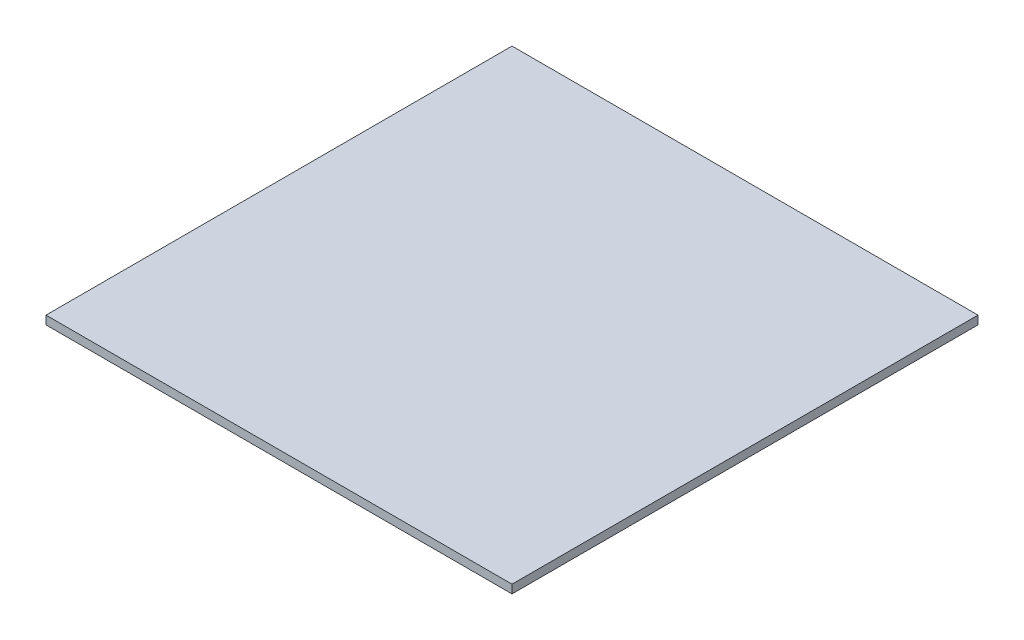
ISO-10303-21;
HEADER;
FILE_DESCRIPTION(('STEP AP214'),'2;1');
FILE_NAME('part.step','',(''),(''),'','','');
FILE_SCHEMA(('AUTOMOTIVE_DESIGN { 1 0 10303 214 1 1 1 1 }'));
ENDSEC;
DATA;
#1=APPLICATION_CONTEXT('core data for automotive mechanical design processes');
#2=APPLICATION_PROTOCOL_DEFINITION('international standard','automotive_design',2000,#1);
#3=PRODUCT_CONTEXT('',#1,'mechanical');
#4=PRODUCT('Part','Part','',(#3));
#5=PRODUCT_RELATED_PRODUCT_CATEGORY('part','',(#4));
#6=PRODUCT_DEFINITION_FORMATION('','',#4);
#7=PRODUCT_DEFINITION_CONTEXT('part definition',#1,'design');
#8=PRODUCT_DEFINITION('design','',#6,#7);
#9=PRODUCT_DEFINITION_SHAPE('','',#8);
#10=(LENGTH_UNIT() NAMED_UNIT(*) SI_UNIT(.MILLI.,.METRE.));
#11=(NAMED_UNIT(*) PLANE_ANGLE_UNIT() SI_UNIT($,.RADIAN.));
#12=(NAMED_UNIT(*) SI_UNIT($,.STERADIAN.) SOLID_ANGLE_UNIT());
#13=UNCERTAINTY_MEASURE_WITH_UNIT(LENGTH_MEASURE(1.E-05),#10,'distance_accuracy_value','');
#14=(GEOMETRIC_REPRESENTATION_CONTEXT(3) GLOBAL_UNCERTAINTY_ASSIGNED_CONTEXT((#13)) GLOBAL_UNIT_ASSIGNED_CONTEXT((#10,
#11,#12)) REPRESENTATION_CONTEXT('',''));
#15=CARTESIAN_POINT('',(0.,0.,0.));
#16=DIRECTION('',(0.,0.,1.));
#17=DIRECTION('',(1.,0.,0.));
#18=AXIS2_PLACEMENT_3D('',#15,#16,#17);
#19=CARTESIAN_POINT('',(55.,-1.,55.));
#20=DIRECTION('',(-1.,0.,0.));
#21=DIRECTION('',(0.,0.,1.));
#22=AXIS2_PLACEMENT_3D('',#19,#20,#21);
#23=PLANE('',#22);
#24=DIRECTION('',(0.,1.,0.));
#25=VECTOR('',#24,1.);
#26=CARTESIAN_POINT('',(55.,-1.,-55.));
#27=LINE('',#26,#25);
#28=CARTESIAN_POINT('',(55.,-1.,-55.));
#29=VERTEX_POINT('',#28);
#30=CARTESIAN_POINT('',(55.,1.,-55.));
#31=VERTEX_POINT('',#30);
#32=EDGE_CURVE('E107',#29,#31,#27,.T.);
#33=ORIENTED_EDGE('',*,*,#32,.T.);
#34=DIRECTION('',(0.,0.,-1.));
#35=VECTOR('',#34,1.);
#36=CARTESIAN_POINT('',(55.,1.,55.));
#37=LINE('',#36,#35);
#38=CARTESIAN_POINT('',(55.,1.,55.));
#39=VERTEX_POINT('',#38);
#40=EDGE_CURVE('E11',#39,#31,#37,.T.);
#41=ORIENTED_EDGE('',*,*,#40,.F.);
#42=DIRECTION('',(0.,1.,0.));
#43=VECTOR('',#42,1.);
#44=CARTESIAN_POINT('',(55.,-1.,55.));
#45=LINE('',#44,#43);
#46=CARTESIAN_POINT('',(55.,-1.,55.));
#47=VERTEX_POINT('',#46);
#48=EDGE_CURVE('E91',#47,#39,#45,.T.);
#49=ORIENTED_EDGE('',*,*,#48,.F.);
#50=DIRECTION('',(0.,0.,-1.));
#51=VECTOR('',#50,1.);
#52=CARTESIAN_POINT('',(55.,-1.,55.));
#53=LINE('',#52,#51);
#54=EDGE_CURVE('E103',#47,#29,#53,.T.);
#55=ORIENTED_EDGE('',*,*,#54,.T.);
#56=EDGE_LOOP('',(#33,#41,#49,#55));
#57=FACE_BOUND('',#56,.T.);
#58=ADVANCED_FACE('F39',(#57),#23,.F.);
#59=CARTESIAN_POINT('',(-55.,1.,55.));
#60=DIRECTION('',(0.,-1.,0.));
#61=DIRECTION('',(0.,0.,-1.));
#62=AXIS2_PLACEMENT_3D('',#59,#60,#61);
#63=PLANE('',#62);
#64=DIRECTION('',(-1.,0.,0.));
#65=VECTOR('',#64,1.);
#66=CARTESIAN_POINT('',(-55.,1.,-55.));
#67=LINE('',#66,#65);
#68=CARTESIAN_POINT('',(-55.,1.,-55.));
#69=VERTEX_POINT('',#68);
#70=EDGE_CURVE('E96',#31,#69,#67,.T.);
#71=ORIENTED_EDGE('',*,*,#70,.T.);
#72=DIRECTION('',(0.,0.,-1.));
#73=VECTOR('',#72,1.);
#74=CARTESIAN_POINT('',(-55.,1.,55.));
#75=LINE('',#74,#73);
#76=CARTESIAN_POINT('',(-55.,1.,55.));
#77=VERTEX_POINT('',#76);
#78=EDGE_CURVE('E48',#77,#69,#75,.T.);
#79=ORIENTED_EDGE('',*,*,#78,.F.);
#80=DIRECTION('',(-1.,0.,0.));
#81=VECTOR('',#80,1.);
#82=CARTESIAN_POINT('',(-55.,1.,55.));
#83=LINE('',#82,#81);
#84=EDGE_CURVE('E86',#39,#77,#83,.T.);
#85=ORIENTED_EDGE('',*,*,#84,.F.);
#86=ORIENTED_EDGE('',*,*,#40,.T.);
#87=EDGE_LOOP('',(#71,#79,#85,#86));
#88=FACE_BOUND('',#87,.T.);
#89=ADVANCED_FACE('F95',(#88),#63,.F.);
#90=CARTESIAN_POINT('',(-55.,-1.,55.));
#91=DIRECTION('',(1.,0.,0.));
#92=DIRECTION('',(0.,0.,-1.));
#93=AXIS2_PLACEMENT_3D('',#90,#91,#92);
#94=PLANE('',#93);
#95=DIRECTION('',(0.,-1.,0.));
#96=VECTOR('',#95,1.);
#97=CARTESIAN_POINT('',(-55.,-1.,-55.));
#98=LINE('',#97,#96);
#99=CARTESIAN_POINT('',(-55.,-1.,-55.));
#100=VERTEX_POINT('',#99);
#101=EDGE_CURVE('E73',#69,#100,#98,.T.);
#102=ORIENTED_EDGE('',*,*,#101,.T.);
#103=DIRECTION('',(0.,0.,-1.));
#104=VECTOR('',#103,1.);
#105=CARTESIAN_POINT('',(-55.,-1.,55.));
#106=LINE('',#105,#104);
#107=CARTESIAN_POINT('',(-55.,-1.,55.));
#108=VERTEX_POINT('',#107);
#109=EDGE_CURVE('E98',#108,#100,#106,.T.);
#110=ORIENTED_EDGE('',*,*,#109,.F.);
#111=DIRECTION('',(0.,-1.,0.));
#112=VECTOR('',#111,1.);
#113=CARTESIAN_POINT('',(-55.,-1.,55.));
#114=LINE('',#113,#112);
#115=EDGE_CURVE('E89',#77,#108,#114,.T.);
#116=ORIENTED_EDGE('',*,*,#115,.F.);
#117=ORIENTED_EDGE('',*,*,#78,.T.);
#118=EDGE_LOOP('',(#102,#110,#116,#117));
#119=FACE_BOUND('',#118,.T.);
#120=ADVANCED_FACE('F99',(#119),#94,.F.);
#121=CARTESIAN_POINT('',(-55.,-1.,55.));
#122=DIRECTION('',(0.,1.,0.));
#123=DIRECTION('',(0.,0.,1.));
#124=AXIS2_PLACEMENT_3D('',#121,#122,#123);
#125=PLANE('',#124);
#126=DIRECTION('',(1.,0.,0.));
#127=VECTOR('',#126,1.);
#128=CARTESIAN_POINT('',(-55.,-1.,-55.));
#129=LINE('',#128,#127);
#130=EDGE_CURVE('E79',#100,#29,#129,.T.);
#131=ORIENTED_EDGE('',*,*,#130,.T.);
#132=ORIENTED_EDGE('',*,*,#54,.F.);
#133=DIRECTION('',(1.,0.,0.));
#134=VECTOR('',#133,1.);
#135=CARTESIAN_POINT('',(-55.,-1.,55.));
#136=LINE('',#135,#134);
#137=EDGE_CURVE('E56',#108,#47,#136,.T.);
#138=ORIENTED_EDGE('',*,*,#137,.F.);
#139=ORIENTED_EDGE('',*,*,#109,.T.);
#140=EDGE_LOOP('',(#131,#132,#138,#139));
#141=FACE_BOUND('',#140,.T.);
#142=ADVANCED_FACE('F120',(#141),#125,.F.);
#143=CARTESIAN_POINT('',(0.,0.,55.));
#144=DIRECTION('',(0.,0.,-1.));
#145=DIRECTION('',(-1.,0.,0.));
#146=AXIS2_PLACEMENT_3D('',#143,#144,#145);
#147=PLANE('',#146);
#148=ORIENTED_EDGE('',*,*,#48,.T.);
#149=ORIENTED_EDGE('',*,*,#84,.T.);
#150=ORIENTED_EDGE('',*,*,#115,.T.);
#151=ORIENTED_EDGE('',*,*,#137,.T.);
#152=EDGE_LOOP('',(#148,#149,#150,#151));
#153=FACE_BOUND('',#152,.T.);
#154=ADVANCED_FACE('F87',(#153),#147,.F.);
#155=CARTESIAN_POINT('',(0.,0.,-55.));
#156=DIRECTION('',(0.,0.,-1.));
#157=DIRECTION('',(-1.,0.,0.));
#158=AXIS2_PLACEMENT_3D('',#155,#156,#157);
#159=PLANE('',#158);
#160=ORIENTED_EDGE('',*,*,#32,.F.);
#161=ORIENTED_EDGE('',*,*,#130,.F.);
#162=ORIENTED_EDGE('',*,*,#101,.F.);
#163=ORIENTED_EDGE('',*,*,#70,.F.);
#164=EDGE_LOOP('',(#160,#161,#162,#163));
#165=FACE_BOUND('',#164,.T.);
#166=ADVANCED_FACE('F123',(#165),#159,.T.);
#167=CLOSED_SHELL('',(#58,#89,#120,#142,#154,#166));
#168=MANIFOLD_SOLID_BREP('B2',#167);
#169=ADVANCED_BREP_SHAPE_REPRESENTATION('',(#18,#168),#14);
#170=SHAPE_DEFINITION_REPRESENTATION(#9,#169);
ENDSEC;
END-ISO-10303-21;
